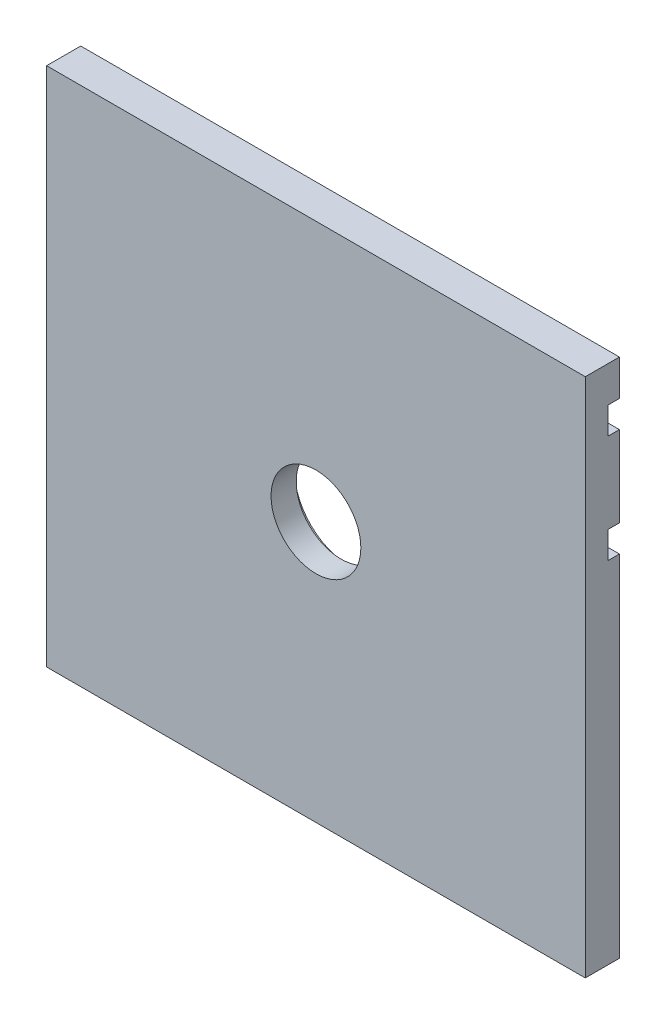
ISO-10303-21;
HEADER;
FILE_DESCRIPTION(('STEP AP214'),'2;1');
FILE_NAME('part.step','',(''),(''),'','','');
FILE_SCHEMA(('AUTOMOTIVE_DESIGN { 1 0 10303 214 1 1 1 1 }'));
ENDSEC;
DATA;
#1=APPLICATION_CONTEXT('core data for automotive mechanical design processes');
#2=APPLICATION_PROTOCOL_DEFINITION('international standard','automotive_design',2000,#1);
#3=PRODUCT_CONTEXT('',#1,'mechanical');
#4=PRODUCT('Part','Part','',(#3));
#5=PRODUCT_RELATED_PRODUCT_CATEGORY('part','',(#4));
#6=PRODUCT_DEFINITION_FORMATION('','',#4);
#7=PRODUCT_DEFINITION_CONTEXT('part definition',#1,'design');
#8=PRODUCT_DEFINITION('design','',#6,#7);
#9=PRODUCT_DEFINITION_SHAPE('','',#8);
#10=(LENGTH_UNIT() NAMED_UNIT(*) SI_UNIT(.MILLI.,.METRE.));
#11=(NAMED_UNIT(*) PLANE_ANGLE_UNIT() SI_UNIT($,.RADIAN.));
#12=(NAMED_UNIT(*) SI_UNIT($,.STERADIAN.) SOLID_ANGLE_UNIT());
#13=UNCERTAINTY_MEASURE_WITH_UNIT(LENGTH_MEASURE(1.E-05),#10,'distance_accuracy_value','');
#14=(GEOMETRIC_REPRESENTATION_CONTEXT(3) GLOBAL_UNCERTAINTY_ASSIGNED_CONTEXT((#13)) GLOBAL_UNIT_ASSIGNED_CONTEXT((#10,
#11,#12)) REPRESENTATION_CONTEXT('',''));
#15=CARTESIAN_POINT('',(0.,0.,0.));
#16=DIRECTION('',(0.,0.,1.));
#17=DIRECTION('',(1.,0.,0.));
#18=AXIS2_PLACEMENT_3D('',#15,#16,#17);
#19=CARTESIAN_POINT('',(0.,0.,0.));
#20=DIRECTION('',(0.,0.,-1.));
#21=DIRECTION('',(-1.,0.,0.));
#22=AXIS2_PLACEMENT_3D('',#19,#20,#21);
#23=PLANE('',#22);
#24=DIRECTION('',(1.,0.,0.));
#25=VECTOR('',#24,1.);
#26=CARTESIAN_POINT('',(600.,420.,0.));
#27=LINE('',#26,#25);
#28=CARTESIAN_POINT('',(0.,420.,0.));
#29=VERTEX_POINT('',#28);
#30=CARTESIAN_POINT('',(600.,420.,0.));
#31=VERTEX_POINT('',#30);
#32=EDGE_CURVE('E241',#29,#31,#27,.T.);
#33=ORIENTED_EDGE('',*,*,#32,.F.);
#34=DIRECTION('',(0.,-1.,0.));
#35=VECTOR('',#34,1.);
#36=CARTESIAN_POINT('',(0.,0.,0.));
#37=LINE('',#36,#35);
#38=CARTESIAN_POINT('',(0.,510.,0.));
#39=VERTEX_POINT('',#38);
#40=EDGE_CURVE('E311',#39,#29,#37,.T.);
#41=ORIENTED_EDGE('',*,*,#40,.F.);
#42=DIRECTION('',(-1.,0.,0.));
#43=VECTOR('',#42,1.);
#44=CARTESIAN_POINT('',(600.,510.,0.));
#45=LINE('',#44,#43);
#46=CARTESIAN_POINT('',(600.,510.,0.));
#47=VERTEX_POINT('',#46);
#48=EDGE_CURVE('E206',#47,#39,#45,.T.);
#49=ORIENTED_EDGE('',*,*,#48,.F.);
#50=DIRECTION('',(0.,1.,0.));
#51=VECTOR('',#50,1.);
#52=CARTESIAN_POINT('',(600.,0.,0.));
#53=LINE('',#52,#51);
#54=EDGE_CURVE('E320',#31,#47,#53,.T.);
#55=ORIENTED_EDGE('',*,*,#54,.F.);
#56=EDGE_LOOP('',(#33,#41,#49,#55));
#57=FACE_BOUND('',#56,.T.);
#58=ADVANCED_FACE('F35',(#57),#23,.T.);
#59=DIRECTION('',(1.,0.,0.));
#60=VECTOR('',#59,1.);
#61=CARTESIAN_POINT('',(600.,540.,0.));
#62=LINE('',#61,#60);
#63=CARTESIAN_POINT('',(0.,540.,0.));
#64=VERTEX_POINT('',#63);
#65=CARTESIAN_POINT('',(600.,540.,0.));
#66=VERTEX_POINT('',#65);
#67=EDGE_CURVE('E268',#64,#66,#62,.T.);
#68=ORIENTED_EDGE('',*,*,#67,.F.);
#69=CARTESIAN_POINT('',(0.,580.,0.));
#70=VERTEX_POINT('',#69);
#71=EDGE_CURVE('E307',#70,#64,#37,.T.);
#72=ORIENTED_EDGE('',*,*,#71,.F.);
#73=DIRECTION('',(-1.,0.,0.));
#74=VECTOR('',#73,1.);
#75=CARTESIAN_POINT('',(0.,580.,0.));
#76=LINE('',#75,#74);
#77=CARTESIAN_POINT('',(600.,580.,0.));
#78=VERTEX_POINT('',#77);
#79=EDGE_CURVE('E300',#78,#70,#76,.T.);
#80=ORIENTED_EDGE('',*,*,#79,.F.);
#81=EDGE_CURVE('E315',#66,#78,#53,.T.);
#82=ORIENTED_EDGE('',*,*,#81,.F.);
#83=EDGE_LOOP('',(#68,#72,#80,#82));
#84=FACE_BOUND('',#83,.T.);
#85=ADVANCED_FACE('F374',(#84),#23,.T.);
#86=CARTESIAN_POINT('',(0.,0.,38.));
#87=DIRECTION('',(1.,0.,0.));
#88=DIRECTION('',(0.,0.,-1.));
#89=AXIS2_PLACEMENT_3D('',#86,#87,#88);
#90=PLANE('',#89);
#91=ORIENTED_EDGE('',*,*,#40,.T.);
#92=DIRECTION('',(0.,0.,-1.));
#93=VECTOR('',#92,1.);
#94=CARTESIAN_POINT('',(0.,420.,12.8));
#95=LINE('',#94,#93);
#96=CARTESIAN_POINT('',(0.,420.,12.8));
#97=VERTEX_POINT('',#96);
#98=EDGE_CURVE('E258',#97,#29,#95,.T.);
#99=ORIENTED_EDGE('',*,*,#98,.F.);
#100=DIRECTION('',(0.,1.,0.));
#101=VECTOR('',#100,1.);
#102=CARTESIAN_POINT('',(0.,390.,12.8));
#103=LINE('',#102,#101);
#104=CARTESIAN_POINT('',(0.,390.,12.8));
#105=VERTEX_POINT('',#104);
#106=EDGE_CURVE('E244',#105,#97,#103,.T.);
#107=ORIENTED_EDGE('',*,*,#106,.F.);
#108=DIRECTION('',(0.,0.,-1.));
#109=VECTOR('',#108,1.);
#110=CARTESIAN_POINT('',(0.,390.,12.8));
#111=LINE('',#110,#109);
#112=CARTESIAN_POINT('',(0.,390.,0.));
#113=VERTEX_POINT('',#112);
#114=EDGE_CURVE('E260',#105,#113,#111,.T.);
#115=ORIENTED_EDGE('',*,*,#114,.T.);
#116=CARTESIAN_POINT('',(0.,0.,0.));
#117=VERTEX_POINT('',#116);
#118=EDGE_CURVE('E295',#113,#117,#37,.T.);
#119=ORIENTED_EDGE('',*,*,#118,.T.);
#120=DIRECTION('',(0.,0.,-1.));
#121=VECTOR('',#120,1.);
#122=CARTESIAN_POINT('',(0.,0.,38.));
#123=LINE('',#122,#121);
#124=CARTESIAN_POINT('',(0.,0.,38.));
#125=VERTEX_POINT('',#124);
#126=EDGE_CURVE('E11',#125,#117,#123,.T.);
#127=ORIENTED_EDGE('',*,*,#126,.F.);
#128=DIRECTION('',(0.,-1.,0.));
#129=VECTOR('',#128,1.);
#130=CARTESIAN_POINT('',(0.,0.,38.));
#131=LINE('',#130,#129);
#132=CARTESIAN_POINT('',(0.,580.,38.));
#133=VERTEX_POINT('',#132);
#134=EDGE_CURVE('E296',#133,#125,#131,.T.);
#135=ORIENTED_EDGE('',*,*,#134,.F.);
#136=DIRECTION('',(0.,0.,-1.));
#137=VECTOR('',#136,1.);
#138=CARTESIAN_POINT('',(0.,580.,38.));
#139=LINE('',#138,#137);
#140=EDGE_CURVE('E306',#133,#70,#139,.T.);
#141=ORIENTED_EDGE('',*,*,#140,.T.);
#142=ORIENTED_EDGE('',*,*,#71,.T.);
#143=DIRECTION('',(0.,0.,-1.));
#144=VECTOR('',#143,1.);
#145=CARTESIAN_POINT('',(0.,540.,12.8));
#146=LINE('',#145,#144);
#147=CARTESIAN_POINT('',(0.,540.,12.8));
#148=VERTEX_POINT('',#147);
#149=EDGE_CURVE('E281',#148,#64,#146,.T.);
#150=ORIENTED_EDGE('',*,*,#149,.F.);
#151=DIRECTION('',(0.,1.,0.));
#152=VECTOR('',#151,1.);
#153=CARTESIAN_POINT('',(0.,540.,12.8));
#154=LINE('',#153,#152);
#155=CARTESIAN_POINT('',(0.,510.,12.8));
#156=VERTEX_POINT('',#155);
#157=EDGE_CURVE('E271',#156,#148,#154,.T.);
#158=ORIENTED_EDGE('',*,*,#157,.F.);
#159=DIRECTION('',(0.,0.,-1.));
#160=VECTOR('',#159,1.);
#161=CARTESIAN_POINT('',(0.,510.,12.8));
#162=LINE('',#161,#160);
#163=EDGE_CURVE('E283',#156,#39,#162,.T.);
#164=ORIENTED_EDGE('',*,*,#163,.T.);
#165=EDGE_LOOP('',(#91,#99,#107,#115,#119,#127,#135,#141,#142,#150,#158,#164));
#166=FACE_BOUND('',#165,.T.);
#167=ADVANCED_FACE('F37',(#166),#90,.F.);
#168=CARTESIAN_POINT('',(0.,0.,38.));
#169=DIRECTION('',(0.,1.,0.));
#170=DIRECTION('',(0.,0.,1.));
#171=AXIS2_PLACEMENT_3D('',#168,#169,#170);
#172=PLANE('',#171);
#173=DIRECTION('',(1.,0.,0.));
#174=VECTOR('',#173,1.);
#175=CARTESIAN_POINT('',(0.,0.,0.));
#176=LINE('',#175,#174);
#177=CARTESIAN_POINT('',(80.,0.,0.));
#178=VERTEX_POINT('',#177);
#179=CARTESIAN_POINT('',(520.,0.,0.));
#180=VERTEX_POINT('',#179);
#181=EDGE_CURVE('E316',#178,#180,#176,.T.);
#182=ORIENTED_EDGE('',*,*,#181,.T.);
#183=DIRECTION('',(0.,0.,-1.));
#184=VECTOR('',#183,1.);
#185=CARTESIAN_POINT('',(520.,0.,12.8));
#186=LINE('',#185,#184);
#187=CARTESIAN_POINT('',(520.,0.,12.8));
#188=VERTEX_POINT('',#187);
#189=EDGE_CURVE('E204',#188,#180,#186,.T.);
#190=ORIENTED_EDGE('',*,*,#189,.F.);
#191=DIRECTION('',(-1.,0.,0.));
#192=VECTOR('',#191,1.);
#193=CARTESIAN_POINT('',(520.,0.,12.8));
#194=LINE('',#193,#192);
#195=CARTESIAN_POINT('',(550.,-1.00421037530083E-13,12.8));
#196=VERTEX_POINT('',#195);
#197=EDGE_CURVE('E181',#196,#188,#194,.T.);
#198=ORIENTED_EDGE('',*,*,#197,.F.);
#199=DIRECTION('',(0.,0.,-1.));
#200=VECTOR('',#199,1.);
#201=CARTESIAN_POINT('',(550.,-1.00421037530083E-13,12.8));
#202=LINE('',#201,#200);
#203=CARTESIAN_POINT('',(550.,-1.00421037530083E-13,0.));
#204=VERTEX_POINT('',#203);
#205=EDGE_CURVE('E207',#196,#204,#202,.T.);
#206=ORIENTED_EDGE('',*,*,#205,.T.);
#207=CARTESIAN_POINT('',(600.,0.,0.));
#208=VERTEX_POINT('',#207);
#209=EDGE_CURVE('E310',#204,#208,#176,.T.);
#210=ORIENTED_EDGE('',*,*,#209,.T.);
#211=DIRECTION('',(0.,0.,-1.));
#212=VECTOR('',#211,1.);
#213=CARTESIAN_POINT('',(600.,0.,38.));
#214=LINE('',#213,#212);
#215=CARTESIAN_POINT('',(600.,0.,38.));
#216=VERTEX_POINT('',#215);
#217=EDGE_CURVE('E44',#216,#208,#214,.T.);
#218=ORIENTED_EDGE('',*,*,#217,.F.);
#219=DIRECTION('',(1.,0.,0.));
#220=VECTOR('',#219,1.);
#221=CARTESIAN_POINT('',(0.,0.,38.));
#222=LINE('',#221,#220);
#223=EDGE_CURVE('E299',#125,#216,#222,.T.);
#224=ORIENTED_EDGE('',*,*,#223,.F.);
#225=ORIENTED_EDGE('',*,*,#126,.T.);
#226=CARTESIAN_POINT('',(49.9999999999999,0.,0.));
#227=VERTEX_POINT('',#226);
#228=EDGE_CURVE('E312',#117,#227,#176,.T.);
#229=ORIENTED_EDGE('',*,*,#228,.T.);
#230=DIRECTION('',(0.,0.,-1.));
#231=VECTOR('',#230,1.);
#232=CARTESIAN_POINT('',(49.9999999999999,-1.00421037530083E-13,12.8));
#233=LINE('',#232,#231);
#234=CARTESIAN_POINT('',(49.9999999999999,-1.00421037530083E-13,12.8));
#235=VERTEX_POINT('',#234);
#236=EDGE_CURVE('E59',#235,#227,#233,.T.);
#237=ORIENTED_EDGE('',*,*,#236,.F.);
#238=DIRECTION('',(-1.,0.,0.));
#239=VECTOR('',#238,1.);
#240=CARTESIAN_POINT('',(80.,0.,12.8));
#241=LINE('',#240,#239);
#242=CARTESIAN_POINT('',(80.,0.,12.8));
#243=VERTEX_POINT('',#242);
#244=EDGE_CURVE('E211',#243,#235,#241,.T.);
#245=ORIENTED_EDGE('',*,*,#244,.F.);
#246=DIRECTION('',(0.,0.,-1.));
#247=VECTOR('',#246,1.);
#248=CARTESIAN_POINT('',(80.,0.,12.8));
#249=LINE('',#248,#247);
#250=EDGE_CURVE('E202',#243,#178,#249,.T.);
#251=ORIENTED_EDGE('',*,*,#250,.T.);
#252=EDGE_LOOP('',(#182,#190,#198,#206,#210,#218,#224,#225,#229,#237,#245,#251));
#253=FACE_BOUND('',#252,.T.);
#254=ADVANCED_FACE('F381',(#253),#172,.F.);
#255=CARTESIAN_POINT('',(600.,0.,38.));
#256=DIRECTION('',(-1.,0.,0.));
#257=DIRECTION('',(0.,0.,1.));
#258=AXIS2_PLACEMENT_3D('',#255,#256,#257);
#259=PLANE('',#258);
#260=DIRECTION('',(0.,-1.,0.));
#261=VECTOR('',#260,1.);
#262=CARTESIAN_POINT('',(600.,390.,12.8));
#263=LINE('',#262,#261);
#264=CARTESIAN_POINT('',(600.,420.,12.8));
#265=VERTEX_POINT('',#264);
#266=CARTESIAN_POINT('',(600.,390.,12.8));
#267=VERTEX_POINT('',#266);
#268=EDGE_CURVE('E237',#265,#267,#263,.T.);
#269=ORIENTED_EDGE('',*,*,#268,.F.);
#270=DIRECTION('',(0.,0.,-1.));
#271=VECTOR('',#270,1.);
#272=CARTESIAN_POINT('',(600.,420.,12.8));
#273=LINE('',#272,#271);
#274=EDGE_CURVE('E254',#265,#31,#273,.T.);
#275=ORIENTED_EDGE('',*,*,#274,.T.);
#276=ORIENTED_EDGE('',*,*,#54,.T.);
#277=DIRECTION('',(0.,0.,-1.));
#278=VECTOR('',#277,1.);
#279=CARTESIAN_POINT('',(600.,510.,12.8));
#280=LINE('',#279,#278);
#281=CARTESIAN_POINT('',(600.,510.,12.8));
#282=VERTEX_POINT('',#281);
#283=EDGE_CURVE('E276',#282,#47,#280,.T.);
#284=ORIENTED_EDGE('',*,*,#283,.F.);
#285=DIRECTION('',(0.,-1.,0.));
#286=VECTOR('',#285,1.);
#287=CARTESIAN_POINT('',(600.,540.,12.8));
#288=LINE('',#287,#286);
#289=CARTESIAN_POINT('',(600.,540.,12.8));
#290=VERTEX_POINT('',#289);
#291=EDGE_CURVE('E264',#290,#282,#288,.T.);
#292=ORIENTED_EDGE('',*,*,#291,.F.);
#293=DIRECTION('',(0.,0.,-1.));
#294=VECTOR('',#293,1.);
#295=CARTESIAN_POINT('',(600.,540.,12.8));
#296=LINE('',#295,#294);
#297=EDGE_CURVE('E252',#290,#66,#296,.T.);
#298=ORIENTED_EDGE('',*,*,#297,.T.);
#299=ORIENTED_EDGE('',*,*,#81,.T.);
#300=DIRECTION('',(0.,0.,-1.));
#301=VECTOR('',#300,1.);
#302=CARTESIAN_POINT('',(600.,580.,38.));
#303=LINE('',#302,#301);
#304=CARTESIAN_POINT('',(600.,580.,38.));
#305=VERTEX_POINT('',#304);
#306=EDGE_CURVE('E324',#305,#78,#303,.T.);
#307=ORIENTED_EDGE('',*,*,#306,.F.);
#308=DIRECTION('',(0.,1.,0.));
#309=VECTOR('',#308,1.);
#310=CARTESIAN_POINT('',(600.,0.,38.));
#311=LINE('',#310,#309);
#312=EDGE_CURVE('E302',#216,#305,#311,.T.);
#313=ORIENTED_EDGE('',*,*,#312,.F.);
#314=ORIENTED_EDGE('',*,*,#217,.T.);
#315=CARTESIAN_POINT('',(600.,390.,0.));
#316=VERTEX_POINT('',#315);
#317=EDGE_CURVE('E317',#208,#316,#53,.T.);
#318=ORIENTED_EDGE('',*,*,#317,.T.);
#319=DIRECTION('',(0.,0.,-1.));
#320=VECTOR('',#319,1.);
#321=CARTESIAN_POINT('',(600.,390.,12.8));
#322=LINE('',#321,#320);
#323=EDGE_CURVE('E249',#267,#316,#322,.T.);
#324=ORIENTED_EDGE('',*,*,#323,.F.);
#325=EDGE_LOOP('',(#269,#275,#276,#284,#292,#298,#299,#307,#313,#314,#318,#324));
#326=FACE_BOUND('',#325,.T.);
#327=ADVANCED_FACE('F333',(#326),#259,.F.);
#328=CARTESIAN_POINT('',(0.,580.,38.));
#329=DIRECTION('',(0.,-1.,0.));
#330=DIRECTION('',(0.,0.,-1.));
#331=AXIS2_PLACEMENT_3D('',#328,#329,#330);
#332=PLANE('',#331);
#333=ORIENTED_EDGE('',*,*,#79,.T.);
#334=ORIENTED_EDGE('',*,*,#140,.F.);
#335=DIRECTION('',(-1.,0.,0.));
#336=VECTOR('',#335,1.);
#337=CARTESIAN_POINT('',(0.,580.,38.));
#338=LINE('',#337,#336);
#339=EDGE_CURVE('E304',#305,#133,#338,.T.);
#340=ORIENTED_EDGE('',*,*,#339,.F.);
#341=ORIENTED_EDGE('',*,*,#306,.T.);
#342=EDGE_LOOP('',(#333,#334,#340,#341));
#343=FACE_BOUND('',#342,.T.);
#344=ADVANCED_FACE('F371',(#343),#332,.F.);
#345=CARTESIAN_POINT('',(0.,0.,38.));
#346=DIRECTION('',(0.,0.,-1.));
#347=DIRECTION('',(-1.,0.,0.));
#348=AXIS2_PLACEMENT_3D('',#345,#346,#347);
#349=PLANE('',#348);
#350=CARTESIAN_POINT('',(300.,290.,38.));
#351=DIRECTION('',(0.,0.,-1.));
#352=DIRECTION('',(-1.,0.,0.));
#353=AXIS2_PLACEMENT_3D('',#350,#351,#352);
#354=CIRCLE('',#353,50.);
#355=CARTESIAN_POINT('',(250.,290.,38.));
#356=VERTEX_POINT('',#355);
#357=EDGE_CURVE('E292',#356,#356,#354,.T.);
#358=ORIENTED_EDGE('',*,*,#357,.T.);
#359=EDGE_LOOP('',(#358));
#360=FACE_BOUND('',#359,.T.);
#361=ORIENTED_EDGE('',*,*,#134,.T.);
#362=ORIENTED_EDGE('',*,*,#223,.T.);
#363=ORIENTED_EDGE('',*,*,#312,.T.);
#364=ORIENTED_EDGE('',*,*,#339,.T.);
#365=EDGE_LOOP('',(#361,#362,#363,#364));
#366=FACE_BOUND('',#365,.T.);
#367=ADVANCED_FACE('F379',(#360,#366),#349,.F.);
#368=DIRECTION('',(0.,1.,0.));
#369=VECTOR('',#368,1.);
#370=CARTESIAN_POINT('',(520.,0.,0.));
#371=LINE('',#370,#369);
#372=CARTESIAN_POINT('',(520.,280.,0.));
#373=VERTEX_POINT('',#372);
#374=EDGE_CURVE('E51',#180,#373,#371,.T.);
#375=ORIENTED_EDGE('',*,*,#374,.F.);
#376=ORIENTED_EDGE('',*,*,#181,.F.);
#377=DIRECTION('',(0.,-1.,0.));
#378=VECTOR('',#377,1.);
#379=CARTESIAN_POINT('',(80.,0.,0.));
#380=LINE('',#379,#378);
#381=CARTESIAN_POINT('',(80.,280.,0.));
#382=VERTEX_POINT('',#381);
#383=EDGE_CURVE('E215',#382,#178,#380,.T.);
#384=ORIENTED_EDGE('',*,*,#383,.F.);
#385=DIRECTION('',(1.,0.,0.));
#386=VECTOR('',#385,1.);
#387=CARTESIAN_POINT('',(80.,280.,0.));
#388=LINE('',#387,#386);
#389=CARTESIAN_POINT('',(49.9999999999999,280.,0.));
#390=VERTEX_POINT('',#389);
#391=EDGE_CURVE('E226',#390,#382,#388,.T.);
#392=ORIENTED_EDGE('',*,*,#391,.F.);
#393=DIRECTION('',(0.,1.,0.));
#394=VECTOR('',#393,1.);
#395=CARTESIAN_POINT('',(49.9999999999999,-1.00421037530083E-13,0.));
#396=LINE('',#395,#394);
#397=EDGE_CURVE('E224',#227,#390,#396,.T.);
#398=ORIENTED_EDGE('',*,*,#397,.F.);
#399=ORIENTED_EDGE('',*,*,#228,.F.);
#400=ORIENTED_EDGE('',*,*,#118,.F.);
#401=DIRECTION('',(-1.,0.,0.));
#402=VECTOR('',#401,1.);
#403=CARTESIAN_POINT('',(600.,390.,0.));
#404=LINE('',#403,#402);
#405=EDGE_CURVE('E250',#316,#113,#404,.T.);
#406=ORIENTED_EDGE('',*,*,#405,.F.);
#407=ORIENTED_EDGE('',*,*,#317,.F.);
#408=ORIENTED_EDGE('',*,*,#209,.F.);
#409=DIRECTION('',(0.,-1.,0.));
#410=VECTOR('',#409,1.);
#411=CARTESIAN_POINT('',(550.,-1.00421037530083E-13,0.));
#412=LINE('',#411,#410);
#413=CARTESIAN_POINT('',(550.,280.,0.));
#414=VERTEX_POINT('',#413);
#415=EDGE_CURVE('E194',#414,#204,#412,.T.);
#416=ORIENTED_EDGE('',*,*,#415,.F.);
#417=DIRECTION('',(1.,0.,0.));
#418=VECTOR('',#417,1.);
#419=CARTESIAN_POINT('',(520.,280.,0.));
#420=LINE('',#419,#418);
#421=EDGE_CURVE('E196',#373,#414,#420,.T.);
#422=ORIENTED_EDGE('',*,*,#421,.F.);
#423=EDGE_LOOP('',(#375,#376,#384,#392,#398,#399,#400,#406,#407,#408,#416,#422));
#424=FACE_BOUND('',#423,.T.);
#425=CARTESIAN_POINT('',(300.,290.,0.));
#426=DIRECTION('',(0.,0.,1.));
#427=DIRECTION('',(1.,0.,0.));
#428=AXIS2_PLACEMENT_3D('',#425,#426,#427);
#429=CIRCLE('',#428,62.);
#430=CARTESIAN_POINT('',(362.,290.,0.));
#431=VERTEX_POINT('',#430);
#432=EDGE_CURVE('E257',#431,#431,#429,.T.);
#433=ORIENTED_EDGE('',*,*,#432,.T.);
#434=EDGE_LOOP('',(#433));
#435=FACE_BOUND('',#434,.T.);
#436=ADVANCED_FACE('F340',(#424,#435),#23,.T.);
#437=CARTESIAN_POINT('',(300.,290.,0.));
#438=DIRECTION('',(0.,0.,1.));
#439=DIRECTION('',(1.,0.,0.));
#440=AXIS2_PLACEMENT_3D('',#437,#438,#439);
#441=CYLINDRICAL_SURFACE('',#440,50.);
#442=CARTESIAN_POINT('',(300.,290.,10.));
#443=DIRECTION('',(0.,0.,1.));
#444=DIRECTION('',(1.,0.,0.));
#445=AXIS2_PLACEMENT_3D('',#442,#443,#444);
#446=CIRCLE('',#445,50.);
#447=CARTESIAN_POINT('',(350.,290.,10.));
#448=VERTEX_POINT('',#447);
#449=EDGE_CURVE('E39',#448,#448,#446,.F.);
#450=ORIENTED_EDGE('',*,*,#449,.T.);
#451=EDGE_LOOP('',(#450));
#452=FACE_BOUND('',#451,.T.);
#453=ORIENTED_EDGE('',*,*,#357,.F.);
#454=EDGE_LOOP('',(#453));
#455=FACE_BOUND('',#454,.T.);
#456=ADVANCED_FACE('F413',(#452,#455),#441,.F.);
#457=CARTESIAN_POINT('',(300.,290.,10.));
#458=DIRECTION('',(0.,0.,1.));
#459=DIRECTION('',(1.,0.,0.));
#460=AXIS2_PLACEMENT_3D('',#457,#458,#459);
#461=PLANE('',#460);
#462=CARTESIAN_POINT('',(300.,290.,10.));
#463=DIRECTION('',(0.,0.,1.));
#464=DIRECTION('',(1.,0.,0.));
#465=AXIS2_PLACEMENT_3D('',#462,#463,#464);
#466=CIRCLE('',#465,62.);
#467=CARTESIAN_POINT('',(362.,290.,10.));
#468=VERTEX_POINT('',#467);
#469=EDGE_CURVE('E287',#468,#468,#466,.T.);
#470=ORIENTED_EDGE('',*,*,#469,.F.);
#471=EDGE_LOOP('',(#470));
#472=FACE_BOUND('',#471,.T.);
#473=ORIENTED_EDGE('',*,*,#449,.F.);
#474=EDGE_LOOP('',(#473));
#475=FACE_BOUND('',#474,.T.);
#476=ADVANCED_FACE('F418',(#472,#475),#461,.F.);
#477=CARTESIAN_POINT('',(300.,290.,10.));
#478=DIRECTION('',(0.,0.,-1.));
#479=DIRECTION('',(-1.,0.,0.));
#480=AXIS2_PLACEMENT_3D('',#477,#478,#479);
#481=CYLINDRICAL_SURFACE('',#480,62.);
#482=ORIENTED_EDGE('',*,*,#469,.T.);
#483=EDGE_LOOP('',(#482));
#484=FACE_BOUND('',#483,.T.);
#485=ORIENTED_EDGE('',*,*,#432,.F.);
#486=EDGE_LOOP('',(#485));
#487=FACE_BOUND('',#486,.T.);
#488=ADVANCED_FACE('F426',(#484,#487),#481,.F.);
#489=CARTESIAN_POINT('',(600.,540.,12.8));
#490=DIRECTION('',(0.,1.,0.));
#491=DIRECTION('',(0.,0.,1.));
#492=AXIS2_PLACEMENT_3D('',#489,#490,#491);
#493=PLANE('',#492);
#494=ORIENTED_EDGE('',*,*,#67,.T.);
#495=ORIENTED_EDGE('',*,*,#297,.F.);
#496=DIRECTION('',(1.,0.,0.));
#497=VECTOR('',#496,1.);
#498=CARTESIAN_POINT('',(600.,540.,12.8));
#499=LINE('',#498,#497);
#500=EDGE_CURVE('E273',#148,#290,#499,.T.);
#501=ORIENTED_EDGE('',*,*,#500,.F.);
#502=ORIENTED_EDGE('',*,*,#149,.T.);
#503=EDGE_LOOP('',(#494,#495,#501,#502));
#504=FACE_BOUND('',#503,.T.);
#505=ADVANCED_FACE('F429',(#504),#493,.F.);
#506=CARTESIAN_POINT('',(600.,510.,12.8));
#507=DIRECTION('',(0.,-1.,0.));
#508=DIRECTION('',(0.,0.,-1.));
#509=AXIS2_PLACEMENT_3D('',#506,#507,#508);
#510=PLANE('',#509);
#511=ORIENTED_EDGE('',*,*,#48,.T.);
#512=ORIENTED_EDGE('',*,*,#163,.F.);
#513=DIRECTION('',(-1.,0.,0.));
#514=VECTOR('',#513,1.);
#515=CARTESIAN_POINT('',(600.,510.,12.8));
#516=LINE('',#515,#514);
#517=EDGE_CURVE('E267',#282,#156,#516,.T.);
#518=ORIENTED_EDGE('',*,*,#517,.F.);
#519=ORIENTED_EDGE('',*,*,#283,.T.);
#520=EDGE_LOOP('',(#511,#512,#518,#519));
#521=FACE_BOUND('',#520,.T.);
#522=ADVANCED_FACE('F434',(#521),#510,.F.);
#523=CARTESIAN_POINT('',(0.,0.,12.8));
#524=DIRECTION('',(0.,0.,-1.));
#525=DIRECTION('',(-1.,0.,0.));
#526=AXIS2_PLACEMENT_3D('',#523,#524,#525);
#527=PLANE('',#526);
#528=ORIENTED_EDGE('',*,*,#291,.T.);
#529=ORIENTED_EDGE('',*,*,#517,.T.);
#530=ORIENTED_EDGE('',*,*,#157,.T.);
#531=ORIENTED_EDGE('',*,*,#500,.T.);
#532=EDGE_LOOP('',(#528,#529,#530,#531));
#533=FACE_BOUND('',#532,.T.);
#534=ADVANCED_FACE('F437',(#533),#527,.T.);
#535=CARTESIAN_POINT('',(600.,420.,12.8));
#536=DIRECTION('',(0.,1.,0.));
#537=DIRECTION('',(0.,0.,1.));
#538=AXIS2_PLACEMENT_3D('',#535,#536,#537);
#539=PLANE('',#538);
#540=ORIENTED_EDGE('',*,*,#32,.T.);
#541=ORIENTED_EDGE('',*,*,#274,.F.);
#542=DIRECTION('',(1.,0.,0.));
#543=VECTOR('',#542,1.);
#544=CARTESIAN_POINT('',(600.,420.,12.8));
#545=LINE('',#544,#543);
#546=EDGE_CURVE('E246',#97,#265,#545,.T.);
#547=ORIENTED_EDGE('',*,*,#546,.F.);
#548=ORIENTED_EDGE('',*,*,#98,.T.);
#549=EDGE_LOOP('',(#540,#541,#547,#548));
#550=FACE_BOUND('',#549,.T.);
#551=ADVANCED_FACE('F356',(#550),#539,.F.);
#552=CARTESIAN_POINT('',(600.,390.,12.8));
#553=DIRECTION('',(0.,-1.,0.));
#554=DIRECTION('',(0.,0.,-1.));
#555=AXIS2_PLACEMENT_3D('',#552,#553,#554);
#556=PLANE('',#555);
#557=ORIENTED_EDGE('',*,*,#405,.T.);
#558=ORIENTED_EDGE('',*,*,#114,.F.);
#559=DIRECTION('',(-1.,0.,0.));
#560=VECTOR('',#559,1.);
#561=CARTESIAN_POINT('',(600.,390.,12.8));
#562=LINE('',#561,#560);
#563=EDGE_CURVE('E240',#267,#105,#562,.T.);
#564=ORIENTED_EDGE('',*,*,#563,.F.);
#565=ORIENTED_EDGE('',*,*,#323,.T.);
#566=EDGE_LOOP('',(#557,#558,#564,#565));
#567=FACE_BOUND('',#566,.T.);
#568=ADVANCED_FACE('F346',(#567),#556,.F.);
#569=CARTESIAN_POINT('',(0.,0.,12.8));
#570=DIRECTION('',(0.,0.,1.));
#571=DIRECTION('',(1.,0.,0.));
#572=AXIS2_PLACEMENT_3D('',#569,#570,#571);
#573=PLANE('',#572);
#574=ORIENTED_EDGE('',*,*,#268,.T.);
#575=ORIENTED_EDGE('',*,*,#563,.T.);
#576=ORIENTED_EDGE('',*,*,#106,.T.);
#577=ORIENTED_EDGE('',*,*,#546,.T.);
#578=EDGE_LOOP('',(#574,#575,#576,#577));
#579=FACE_BOUND('',#578,.T.);
#580=ADVANCED_FACE('F354',(#579),#573,.F.);
#581=CARTESIAN_POINT('',(80.,0.,12.8));
#582=DIRECTION('',(1.,0.,0.));
#583=DIRECTION('',(0.,0.,-1.));
#584=AXIS2_PLACEMENT_3D('',#581,#582,#583);
#585=PLANE('',#584);
#586=ORIENTED_EDGE('',*,*,#383,.T.);
#587=ORIENTED_EDGE('',*,*,#250,.F.);
#588=DIRECTION('',(0.,-1.,0.));
#589=VECTOR('',#588,1.);
#590=CARTESIAN_POINT('',(80.,0.,12.8));
#591=LINE('',#590,#589);
#592=CARTESIAN_POINT('',(80.,280.,12.8));
#593=VERTEX_POINT('',#592);
#594=EDGE_CURVE('E221',#593,#243,#591,.T.);
#595=ORIENTED_EDGE('',*,*,#594,.F.);
#596=DIRECTION('',(0.,0.,-1.));
#597=VECTOR('',#596,1.);
#598=CARTESIAN_POINT('',(80.,280.,12.8));
#599=LINE('',#598,#597);
#600=EDGE_CURVE('E232',#593,#382,#599,.T.);
#601=ORIENTED_EDGE('',*,*,#600,.T.);
#602=EDGE_LOOP('',(#586,#587,#595,#601));
#603=FACE_BOUND('',#602,.T.);
#604=ADVANCED_FACE('F451',(#603),#585,.F.);
#605=CARTESIAN_POINT('',(80.,280.,12.8));
#606=DIRECTION('',(0.,1.,0.));
#607=DIRECTION('',(0.,0.,1.));
#608=AXIS2_PLACEMENT_3D('',#605,#606,#607);
#609=PLANE('',#608);
#610=ORIENTED_EDGE('',*,*,#391,.T.);
#611=ORIENTED_EDGE('',*,*,#600,.F.);
#612=DIRECTION('',(1.,0.,0.));
#613=VECTOR('',#612,1.);
#614=CARTESIAN_POINT('',(80.,280.,12.8));
#615=LINE('',#614,#613);
#616=CARTESIAN_POINT('',(49.9999999999999,280.,12.8));
#617=VERTEX_POINT('',#616);
#618=EDGE_CURVE('E218',#617,#593,#615,.T.);
#619=ORIENTED_EDGE('',*,*,#618,.F.);
#620=DIRECTION('',(0.,0.,-1.));
#621=VECTOR('',#620,1.);
#622=CARTESIAN_POINT('',(49.9999999999999,280.,12.8));
#623=LINE('',#622,#621);
#624=EDGE_CURVE('E234',#617,#390,#623,.T.);
#625=ORIENTED_EDGE('',*,*,#624,.T.);
#626=EDGE_LOOP('',(#610,#611,#619,#625));
#627=FACE_BOUND('',#626,.T.);
#628=ADVANCED_FACE('F388',(#627),#609,.F.);
#629=CARTESIAN_POINT('',(49.9999999999999,-1.00421037530083E-13,12.8));
#630=DIRECTION('',(-1.,0.,0.));
#631=DIRECTION('',(0.,0.,1.));
#632=AXIS2_PLACEMENT_3D('',#629,#630,#631);
#633=PLANE('',#632);
#634=ORIENTED_EDGE('',*,*,#397,.T.);
#635=ORIENTED_EDGE('',*,*,#624,.F.);
#636=DIRECTION('',(0.,1.,0.));
#637=VECTOR('',#636,1.);
#638=CARTESIAN_POINT('',(49.9999999999999,-1.00421037530083E-13,12.8));
#639=LINE('',#638,#637);
#640=EDGE_CURVE('E214',#235,#617,#639,.T.);
#641=ORIENTED_EDGE('',*,*,#640,.F.);
#642=ORIENTED_EDGE('',*,*,#236,.T.);
#643=EDGE_LOOP('',(#634,#635,#641,#642));
#644=FACE_BOUND('',#643,.T.);
#645=ADVANCED_FACE('F385',(#644),#633,.F.);
#646=CARTESIAN_POINT('',(0.,0.,12.8));
#647=DIRECTION('',(0.,0.,-1.));
#648=DIRECTION('',(-1.,0.,0.));
#649=AXIS2_PLACEMENT_3D('',#646,#647,#648);
#650=PLANE('',#649);
#651=ORIENTED_EDGE('',*,*,#244,.T.);
#652=ORIENTED_EDGE('',*,*,#640,.T.);
#653=ORIENTED_EDGE('',*,*,#618,.T.);
#654=ORIENTED_EDGE('',*,*,#594,.T.);
#655=EDGE_LOOP('',(#651,#652,#653,#654));
#656=FACE_BOUND('',#655,.T.);
#657=ADVANCED_FACE('F391',(#656),#650,.T.);
#658=CARTESIAN_POINT('',(520.,0.,12.8));
#659=DIRECTION('',(-1.,0.,0.));
#660=DIRECTION('',(0.,0.,1.));
#661=AXIS2_PLACEMENT_3D('',#658,#659,#660);
#662=PLANE('',#661);
#663=ORIENTED_EDGE('',*,*,#374,.T.);
#664=DIRECTION('',(0.,0.,-1.));
#665=VECTOR('',#664,1.);
#666=CARTESIAN_POINT('',(520.,280.,12.8));
#667=LINE('',#666,#665);
#668=CARTESIAN_POINT('',(520.,280.,12.8));
#669=VERTEX_POINT('',#668);
#670=EDGE_CURVE('E171',#669,#373,#667,.T.);
#671=ORIENTED_EDGE('',*,*,#670,.F.);
#672=DIRECTION('',(0.,1.,0.));
#673=VECTOR('',#672,1.);
#674=CARTESIAN_POINT('',(520.,0.,12.8));
#675=LINE('',#674,#673);
#676=EDGE_CURVE('E175',#188,#669,#675,.T.);
#677=ORIENTED_EDGE('',*,*,#676,.F.);
#678=ORIENTED_EDGE('',*,*,#189,.T.);
#679=EDGE_LOOP('',(#663,#671,#677,#678));
#680=FACE_BOUND('',#679,.T.);
#681=ADVANCED_FACE('F173',(#680),#662,.F.);
#682=CARTESIAN_POINT('',(550.,-1.00421037530083E-13,12.8));
#683=DIRECTION('',(1.,0.,0.));
#684=DIRECTION('',(0.,0.,-1.));
#685=AXIS2_PLACEMENT_3D('',#682,#683,#684);
#686=PLANE('',#685);
#687=ORIENTED_EDGE('',*,*,#415,.T.);
#688=ORIENTED_EDGE('',*,*,#205,.F.);
#689=DIRECTION('',(0.,-1.,0.));
#690=VECTOR('',#689,1.);
#691=CARTESIAN_POINT('',(550.,-1.00421037530083E-13,12.8));
#692=LINE('',#691,#690);
#693=CARTESIAN_POINT('',(550.,280.,12.8));
#694=VERTEX_POINT('',#693);
#695=EDGE_CURVE('E189',#694,#196,#692,.T.);
#696=ORIENTED_EDGE('',*,*,#695,.F.);
#697=DIRECTION('',(0.,0.,-1.));
#698=VECTOR('',#697,1.);
#699=CARTESIAN_POINT('',(550.,280.,12.8));
#700=LINE('',#699,#698);
#701=EDGE_CURVE('E180',#694,#414,#700,.T.);
#702=ORIENTED_EDGE('',*,*,#701,.T.);
#703=EDGE_LOOP('',(#687,#688,#696,#702));
#704=FACE_BOUND('',#703,.T.);
#705=ADVANCED_FACE('F395',(#704),#686,.F.);
#706=CARTESIAN_POINT('',(520.,280.,12.8));
#707=DIRECTION('',(0.,1.,0.));
#708=DIRECTION('',(0.,0.,1.));
#709=AXIS2_PLACEMENT_3D('',#706,#707,#708);
#710=PLANE('',#709);
#711=ORIENTED_EDGE('',*,*,#421,.T.);
#712=ORIENTED_EDGE('',*,*,#701,.F.);
#713=DIRECTION('',(1.,0.,0.));
#714=VECTOR('',#713,1.);
#715=CARTESIAN_POINT('',(520.,280.,12.8));
#716=LINE('',#715,#714);
#717=EDGE_CURVE('E184',#669,#694,#716,.T.);
#718=ORIENTED_EDGE('',*,*,#717,.F.);
#719=ORIENTED_EDGE('',*,*,#670,.T.);
#720=EDGE_LOOP('',(#711,#712,#718,#719));
#721=FACE_BOUND('',#720,.T.);
#722=ADVANCED_FACE('F185',(#721),#710,.F.);
#723=CARTESIAN_POINT('',(0.,0.,12.8));
#724=DIRECTION('',(0.,0.,-1.));
#725=DIRECTION('',(-1.,0.,0.));
#726=AXIS2_PLACEMENT_3D('',#723,#724,#725);
#727=PLANE('',#726);
#728=ORIENTED_EDGE('',*,*,#676,.T.);
#729=ORIENTED_EDGE('',*,*,#717,.T.);
#730=ORIENTED_EDGE('',*,*,#695,.T.);
#731=ORIENTED_EDGE('',*,*,#197,.T.);
#732=EDGE_LOOP('',(#728,#729,#730,#731));
#733=FACE_BOUND('',#732,.T.);
#734=ADVANCED_FACE('F191',(#733),#727,.T.);
#735=CLOSED_SHELL('',(#58,#85,#167,#254,#327,#344,#367,#436,#456,#476,#488,#505,#522,#534,#551,
#568,#580,#604,#628,#645,#657,#681,#705,#722,#734));
#736=MANIFOLD_SOLID_BREP('B2',#735);
#737=ADVANCED_BREP_SHAPE_REPRESENTATION('',(#18,#736),#14);
#738=SHAPE_DEFINITION_REPRESENTATION(#9,#737);
ENDSEC;
END-ISO-10303-21;
